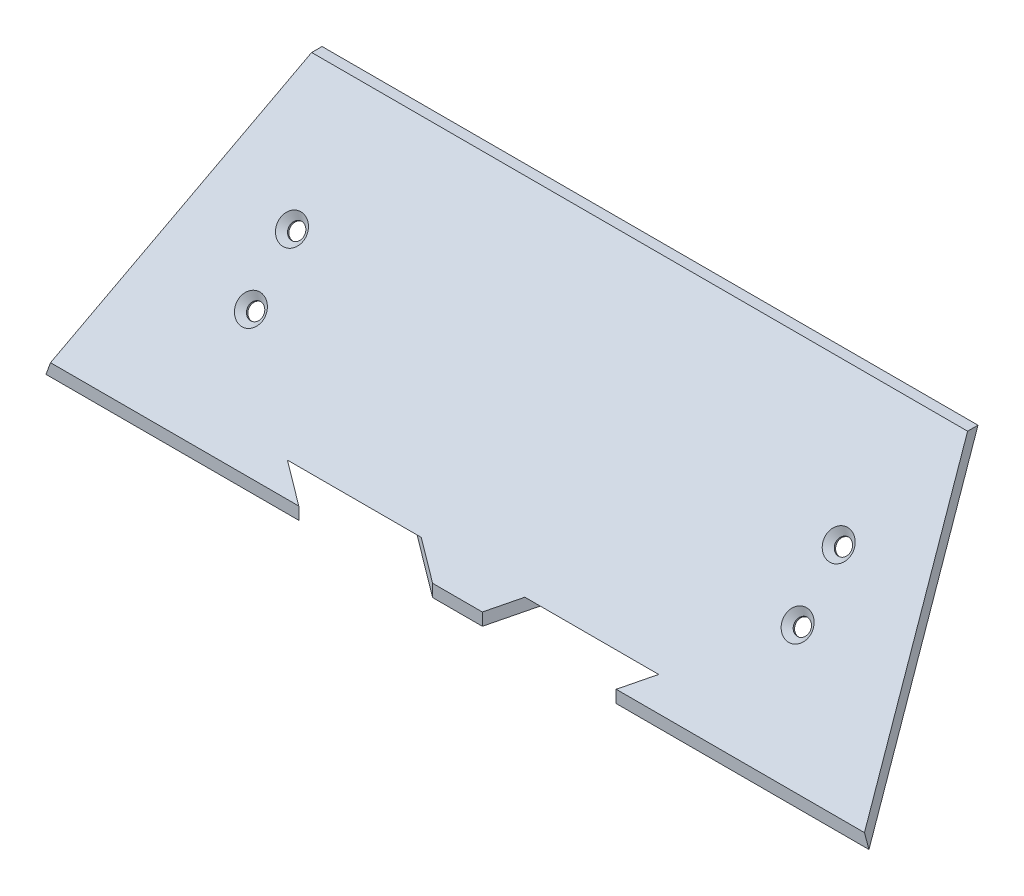
ISO-10303-21;
HEADER;
FILE_DESCRIPTION(('STEP AP214'),'2;1');
FILE_NAME('part.step','',(''),(''),'','','');
FILE_SCHEMA(('AUTOMOTIVE_DESIGN { 1 0 10303 214 1 1 1 1 }'));
ENDSEC;
DATA;
#1=APPLICATION_CONTEXT('core data for automotive mechanical design processes');
#2=APPLICATION_PROTOCOL_DEFINITION('international standard','automotive_design',2000,#1);
#3=PRODUCT_CONTEXT('',#1,'mechanical');
#4=PRODUCT('Part','Part','',(#3));
#5=PRODUCT_RELATED_PRODUCT_CATEGORY('part','',(#4));
#6=PRODUCT_DEFINITION_FORMATION('','',#4);
#7=PRODUCT_DEFINITION_CONTEXT('part definition',#1,'design');
#8=PRODUCT_DEFINITION('design','',#6,#7);
#9=PRODUCT_DEFINITION_SHAPE('','',#8);
#10=(LENGTH_UNIT() NAMED_UNIT(*) SI_UNIT(.MILLI.,.METRE.));
#11=(NAMED_UNIT(*) PLANE_ANGLE_UNIT() SI_UNIT($,.RADIAN.));
#12=(NAMED_UNIT(*) SI_UNIT($,.STERADIAN.) SOLID_ANGLE_UNIT());
#13=UNCERTAINTY_MEASURE_WITH_UNIT(LENGTH_MEASURE(1.E-05),#10,'distance_accuracy_value','');
#14=(GEOMETRIC_REPRESENTATION_CONTEXT(3) GLOBAL_UNCERTAINTY_ASSIGNED_CONTEXT((#13)) GLOBAL_UNIT_ASSIGNED_CONTEXT((#10,
#11,#12)) REPRESENTATION_CONTEXT('',''));
#15=CARTESIAN_POINT('',(0.,0.,0.));
#16=DIRECTION('',(0.,0.,1.));
#17=DIRECTION('',(1.,0.,0.));
#18=AXIS2_PLACEMENT_3D('',#15,#16,#17);
#19=CARTESIAN_POINT('',(186.947944,57.0166879013453,-47.8426817889694));
#20=DIRECTION('',(0.,0.642787609686543,0.766044443118975));
#21=DIRECTION('',(0.,-0.766044443118975,0.642787609686543));
#22=AXIS2_PLACEMENT_3D('',#19,#20,#21);
#23=PLANE('',#22);
#24=CARTESIAN_POINT('',(155.570266506865,35.7397552943462,-29.9892154858524));
#25=DIRECTION('',(0.,0.642787609686543,0.766044443118975));
#26=DIRECTION('',(0.,-0.766044443118975,0.642787609686543));
#27=AXIS2_PLACEMENT_3D('',#24,#25,#26);
#28=CIRCLE('',#27,1.75);
#29=CARTESIAN_POINT('',(155.570266506865,34.399177518888,-28.864337168901));
#30=VERTEX_POINT('',#29);
#31=EDGE_CURVE('E184',#30,#30,#28,.T.);
#32=ORIENTED_EDGE('',*,*,#31,.T.);
#33=EDGE_LOOP('',(#32));
#34=FACE_BOUND('',#33,.T.);
#35=CARTESIAN_POINT('',(155.570266506865,24.6248801619798,-20.6627278617022));
#36=DIRECTION('',(0.,0.642787609686543,0.766044443118975));
#37=DIRECTION('',(0.,-0.766044443118975,0.642787609686543));
#38=AXIS2_PLACEMENT_3D('',#35,#36,#37);
#39=CIRCLE('',#38,1.74999999999999);
#40=CARTESIAN_POINT('',(155.570266506865,23.2843023865216,-19.5378495447508));
#41=VERTEX_POINT('',#40);
#42=EDGE_CURVE('E191',#41,#41,#39,.T.);
#43=ORIENTED_EDGE('',*,*,#42,.T.);
#44=EDGE_LOOP('',(#43));
#45=FACE_BOUND('',#44,.T.);
#46=CARTESIAN_POINT('',(31.3776774931355,35.7397552943464,-29.9892154858526));
#47=DIRECTION('',(0.,0.642787609686543,0.766044443118975));
#48=DIRECTION('',(0.,-0.766044443118975,0.642787609686543));
#49=AXIS2_PLACEMENT_3D('',#46,#47,#48);
#50=CIRCLE('',#49,1.74999999999999);
#51=CARTESIAN_POINT('',(31.3776774931355,34.3991775188882,-28.8643371689012));
#52=VERTEX_POINT('',#51);
#53=EDGE_CURVE('E198',#52,#52,#50,.T.);
#54=ORIENTED_EDGE('',*,*,#53,.T.);
#55=EDGE_LOOP('',(#54));
#56=FACE_BOUND('',#55,.T.);
#57=CARTESIAN_POINT('',(31.3776774931354,24.6248801619801,-20.6627278617024));
#58=DIRECTION('',(0.,0.642787609686543,0.766044443118975));
#59=DIRECTION('',(0.,-0.766044443118975,0.642787609686543));
#60=AXIS2_PLACEMENT_3D('',#57,#58,#59);
#61=CIRCLE('',#60,1.74999999999999);
#62=CARTESIAN_POINT('',(31.3776774931354,23.2843023865219,-19.537849544751));
#63=VERTEX_POINT('',#62);
#64=EDGE_CURVE('E205',#63,#63,#61,.T.);
#65=ORIENTED_EDGE('',*,*,#64,.T.);
#66=EDGE_LOOP('',(#65));
#67=FACE_BOUND('',#66,.T.);
#68=DIRECTION('',(-0.743960541112585,0.511888937521243,-0.429525818677809));
#69=VECTOR('',#68,1.);
#70=CARTESIAN_POINT('',(95.2863367344399,-21.1586125236348,17.7541839648051));
#71=LINE('',#70,#69);
#72=CARTESIAN_POINT('',(57.4238938848892,4.89299179025889,-4.10570760655973));
#73=VERTEX_POINT('',#72);
#74=CARTESIAN_POINT('',(47.2130717621952,11.9186424783822,-10.0009285077445));
#75=VERTEX_POINT('',#74);
#76=EDGE_CURVE('E157',#73,#75,#71,.T.);
#77=ORIENTED_EDGE('',*,*,#76,.F.);
#78=DIRECTION('',(-1.,0.,0.));
#79=VECTOR('',#78,1.);
#80=CARTESIAN_POINT('',(186.947944,4.89299179025889,-4.10570760655973));
#81=LINE('',#80,#79);
#82=CARTESIAN_POINT('',(0.,4.89299179025889,-4.10570760655973));
#83=VERTEX_POINT('',#82);
#84=EDGE_CURVE('E229',#73,#83,#81,.T.);
#85=ORIENTED_EDGE('',*,*,#84,.T.);
#86=DIRECTION('',(-0.268573407547186,-0.737899372701883,0.619171091480102));
#87=VECTOR('',#86,1.);
#88=CARTESIAN_POINT('',(31.0878980749675,90.3062897695394,-75.7759744386099));
#89=LINE('',#88,#87);
#90=CARTESIAN_POINT('',(18.9714738843725,57.0166879013459,-47.8426817889694));
#91=VERTEX_POINT('',#90);
#92=EDGE_CURVE('E220',#91,#83,#89,.T.);
#93=ORIENTED_EDGE('',*,*,#92,.F.);
#94=DIRECTION('',(-1.,0.,0.));
#95=VECTOR('',#94,1.);
#96=CARTESIAN_POINT('',(186.947944,57.0166879013453,-47.8426817889694));
#97=LINE('',#96,#95);
#98=CARTESIAN_POINT('',(167.976470115628,57.0166879013453,-47.8426817889694));
#99=VERTEX_POINT('',#98);
#100=EDGE_CURVE('E236',#99,#91,#97,.T.);
#101=ORIENTED_EDGE('',*,*,#100,.F.);
#102=DIRECTION('',(-0.26857340754718,0.737899372701884,-0.619171091480103));
#103=VECTOR('',#102,1.);
#104=CARTESIAN_POINT('',(169.344914308708,53.2569183810736,-44.6878605711978));
#105=LINE('',#104,#103);
#106=CARTESIAN_POINT('',(186.947944,4.89299179025889,-4.1057076065598));
#107=VERTEX_POINT('',#106);
#108=EDGE_CURVE('E216',#107,#99,#105,.T.);
#109=ORIENTED_EDGE('',*,*,#108,.F.);
#110=CARTESIAN_POINT('',(129.524050115111,4.89299179025889,-4.10570760655973));
#111=VERTEX_POINT('',#110);
#112=EDGE_CURVE('E224',#107,#111,#81,.T.);
#113=ORIENTED_EDGE('',*,*,#112,.T.);
#114=DIRECTION('',(0.743960541112587,0.511888937521242,-0.429525818677808));
#115=VECTOR('',#114,1.);
#116=CARTESIAN_POINT('',(195.133048070905,50.0358702085142,-41.9850802375989));
#117=LINE('',#116,#115);
#118=CARTESIAN_POINT('',(139.734872237805,11.9186424783819,-10.0009285077442));
#119=VERTEX_POINT('',#118);
#120=EDGE_CURVE('E65',#111,#119,#117,.T.);
#121=ORIENTED_EDGE('',*,*,#120,.T.);
#122=DIRECTION('',(1.,0.,0.));
#123=VECTOR('',#122,1.);
#124=CARTESIAN_POINT('',(186.947944,11.9186424783817,-10.0009285077441));
#125=LINE('',#124,#123);
#126=CARTESIAN_POINT('',(109.334872237805,11.918642478382,-10.0009285077443));
#127=VERTEX_POINT('',#126);
#128=EDGE_CURVE('E176',#127,#119,#125,.T.);
#129=ORIENTED_EDGE('',*,*,#128,.F.);
#130=DIRECTION('',(0.743960541112587,0.511888937521242,-0.429525818677808));
#131=VECTOR('',#130,1.);
#132=CARTESIAN_POINT('',(181.558757587574,61.6129554053289,-51.6994081563542));
#133=LINE('',#132,#131);
#134=CARTESIAN_POINT('',(99.1240501151109,4.89299179025889,-4.10570760655973));
#135=VERTEX_POINT('',#134);
#136=EDGE_CURVE('E174',#135,#127,#133,.T.);
#137=ORIENTED_EDGE('',*,*,#136,.F.);
#138=CARTESIAN_POINT('',(87.8238938848893,4.89299179025889,-4.10570760655973));
#139=VERTEX_POINT('',#138);
#140=EDGE_CURVE('E228',#135,#139,#81,.T.);
#141=ORIENTED_EDGE('',*,*,#140,.T.);
#142=DIRECTION('',(-0.743960541112585,0.511888937521243,-0.429525818677809));
#143=VECTOR('',#142,1.);
#144=CARTESIAN_POINT('',(108.860627217771,-9.5815273268201,8.03985604604986));
#145=LINE('',#144,#143);
#146=CARTESIAN_POINT('',(77.6130717621954,11.9186424783821,-10.0009285077444));
#147=VERTEX_POINT('',#146);
#148=EDGE_CURVE('E57',#139,#147,#145,.T.);
#149=ORIENTED_EDGE('',*,*,#148,.T.);
#150=DIRECTION('',(-1.,0.,0.));
#151=VECTOR('',#150,1.);
#152=CARTESIAN_POINT('',(186.947944,11.9186424783817,-10.0009285077441));
#153=LINE('',#152,#151);
#154=EDGE_CURVE('E145',#147,#75,#153,.T.);
#155=ORIENTED_EDGE('',*,*,#154,.T.);
#156=EDGE_LOOP('',(#77,#85,#93,#101,#109,#113,#121,#129,#137,#141,#149,#155));
#157=FACE_BOUND('',#156,.T.);
#158=ADVANCED_FACE('F43',(#34,#45,#56,#67,#157),#23,.F.);
#159=CARTESIAN_POINT('',(186.947944,0.,2.36220000000002));
#160=DIRECTION('',(0.,-0.642787609686543,-0.766044443118975));
#161=DIRECTION('',(0.,0.766044443118975,-0.642787609686543));
#162=AXIS2_PLACEMENT_3D('',#159,#160,#161);
#163=PLANE('',#162);
#164=CARTESIAN_POINT('',(155.570266506865,36.9029117314287,-28.6030196232102));
#165=DIRECTION('',(0.,0.642787609686543,0.766044443118975));
#166=DIRECTION('',(0.,-0.766044443118975,0.642787609686543));
#167=AXIS2_PLACEMENT_3D('',#164,#165,#166);
#168=CIRCLE('',#167,3.15000000000001);
#169=CARTESIAN_POINT('',(155.570266506865,34.4898717356039,-26.5782386526976));
#170=VERTEX_POINT('',#169);
#171=EDGE_CURVE('E178',#170,#170,#168,.T.);
#172=ORIENTED_EDGE('',*,*,#171,.F.);
#173=EDGE_LOOP('',(#172));
#174=FACE_BOUND('',#173,.T.);
#175=CARTESIAN_POINT('',(155.570266506865,25.7880365990624,-19.27653199906));
#176=DIRECTION('',(0.,0.642787609686543,0.766044443118975));
#177=DIRECTION('',(0.,-0.766044443118975,0.642787609686543));
#178=AXIS2_PLACEMENT_3D('',#175,#176,#177);
#179=CIRCLE('',#178,3.14999999999999);
#180=CARTESIAN_POINT('',(155.570266506865,23.3749966032376,-17.2517510285474));
#181=VERTEX_POINT('',#180);
#182=EDGE_CURVE('E185',#181,#181,#179,.T.);
#183=ORIENTED_EDGE('',*,*,#182,.F.);
#184=EDGE_LOOP('',(#183));
#185=FACE_BOUND('',#184,.T.);
#186=CARTESIAN_POINT('',(31.3776774931355,36.9029117314291,-28.6030196232102));
#187=DIRECTION('',(0.,0.642787609686544,0.766044443118975));
#188=DIRECTION('',(0.,-0.766044443118975,0.642787609686544));
#189=AXIS2_PLACEMENT_3D('',#186,#187,#188);
#190=CIRCLE('',#189,3.15);
#191=CARTESIAN_POINT('',(31.3776774931355,34.4898717356044,-26.5782386526976));
#192=VERTEX_POINT('',#191);
#193=EDGE_CURVE('E192',#192,#192,#190,.T.);
#194=ORIENTED_EDGE('',*,*,#193,.F.);
#195=EDGE_LOOP('',(#194));
#196=FACE_BOUND('',#195,.T.);
#197=CARTESIAN_POINT('',(31.3776774931354,25.7880365990628,-19.27653199906));
#198=DIRECTION('',(0.,0.642787609686544,0.766044443118975));
#199=DIRECTION('',(0.,-0.766044443118975,0.642787609686544));
#200=AXIS2_PLACEMENT_3D('',#197,#198,#199);
#201=CIRCLE('',#200,3.15);
#202=CARTESIAN_POINT('',(31.3776774931354,23.374996603238,-17.2517510285474));
#203=VERTEX_POINT('',#202);
#204=EDGE_CURVE('E199',#203,#203,#201,.T.);
#205=ORIENTED_EDGE('',*,*,#204,.F.);
#206=EDGE_LOOP('',(#205));
#207=FACE_BOUND('',#206,.T.);
#208=DIRECTION('',(-0.743960541112585,0.511888937521243,-0.429525818677809));
#209=VECTOR('',#208,1.);
#210=CARTESIAN_POINT('',(88.36558842516,-13.5815672442369,13.7584880654487));
#211=LINE('',#210,#209);
#212=CARTESIAN_POINT('',(57.4238938848892,7.70815212668492,-4.10570760655973));
#213=VERTEX_POINT('',#212);
#214=CARTESIAN_POINT('',(51.3045221798344,11.9186424783822,-7.63872850774447));
#215=VERTEX_POINT('',#214);
#216=EDGE_CURVE('E151',#213,#215,#211,.T.);
#217=ORIENTED_EDGE('',*,*,#216,.T.);
#218=DIRECTION('',(-1.,0.,0.));
#219=VECTOR('',#218,1.);
#220=CARTESIAN_POINT('',(125.977469715276,11.9186424783819,-7.63872850774424));
#221=LINE('',#220,#219);
#222=CARTESIAN_POINT('',(81.7045221798346,11.9186424783822,-7.63872850774445));
#223=VERTEX_POINT('',#222);
#224=EDGE_CURVE('E138',#223,#215,#221,.T.);
#225=ORIENTED_EDGE('',*,*,#224,.F.);
#226=DIRECTION('',(-0.743960541112585,0.511888937521243,-0.429525818677809));
#227=VECTOR('',#226,1.);
#228=CARTESIAN_POINT('',(101.939878908491,-2.0044820474222,4.04416014669348));
#229=LINE('',#228,#227);
#230=CARTESIAN_POINT('',(87.8238938848893,7.70815212668492,-4.10570760655973));
#231=VERTEX_POINT('',#230);
#232=EDGE_CURVE('E130',#231,#223,#229,.T.);
#233=ORIENTED_EDGE('',*,*,#232,.F.);
#234=DIRECTION('',(-1.,0.,0.));
#235=VECTOR('',#234,1.);
#236=CARTESIAN_POINT('',(186.947944,7.70815212668491,-4.10570760655973));
#237=LINE('',#236,#235);
#238=CARTESIAN_POINT('',(99.1240501151109,7.70815212668491,-4.10570760655973));
#239=VERTEX_POINT('',#238);
#240=EDGE_CURVE('E233',#239,#231,#237,.T.);
#241=ORIENTED_EDGE('',*,*,#240,.F.);
#242=DIRECTION('',(0.743960541112587,0.511888937521242,-0.429525818677808));
#243=VECTOR('',#242,1.);
#244=CARTESIAN_POINT('',(85.0080650915091,-2.00448204742218,4.04416014669347));
#245=LINE('',#244,#243);
#246=CARTESIAN_POINT('',(105.243421820166,11.9186424783821,-7.63872850774437));
#247=VERTEX_POINT('',#246);
#248=EDGE_CURVE('E161',#239,#247,#245,.T.);
#249=ORIENTED_EDGE('',*,*,#248,.T.);
#250=DIRECTION('',(1.,0.,0.));
#251=VECTOR('',#250,1.);
#252=CARTESIAN_POINT('',(60.9704742847236,11.9186424783822,-7.63872850774444));
#253=LINE('',#252,#251);
#254=CARTESIAN_POINT('',(135.643421820166,11.9186424783821,-7.63872850774434));
#255=VERTEX_POINT('',#254);
#256=EDGE_CURVE('E164',#247,#255,#253,.T.);
#257=ORIENTED_EDGE('',*,*,#256,.T.);
#258=DIRECTION('',(0.743960541112587,0.511888937521242,-0.429525818677808));
#259=VECTOR('',#258,1.);
#260=CARTESIAN_POINT('',(98.5823555748401,-13.5815672442369,13.7584880654487));
#261=LINE('',#260,#259);
#262=CARTESIAN_POINT('',(129.524050115111,7.70815212668492,-4.10570760655973));
#263=VERTEX_POINT('',#262);
#264=EDGE_CURVE('E168',#263,#255,#261,.T.);
#265=ORIENTED_EDGE('',*,*,#264,.F.);
#266=CARTESIAN_POINT('',(185.923309432854,7.70815212668491,-4.10570760655973));
#267=VERTEX_POINT('',#266);
#268=EDGE_CURVE('E230',#267,#263,#237,.T.);
#269=ORIENTED_EDGE('',*,*,#268,.F.);
#270=DIRECTION('',(0.26857340754718,-0.737899372701884,0.619171091480104));
#271=VECTOR('',#270,1.);
#272=CARTESIAN_POINT('',(188.600387824774,0.352939694774287,2.06604843228709));
#273=LINE('',#272,#271);
#274=CARTESIAN_POINT('',(167.976470115628,57.0166879013453,-45.4804817889699));
#275=VERTEX_POINT('',#274);
#276=EDGE_CURVE('E209',#275,#267,#273,.T.);
#277=ORIENTED_EDGE('',*,*,#276,.F.);
#278=DIRECTION('',(-1.,0.,0.));
#279=VECTOR('',#278,1.);
#280=CARTESIAN_POINT('',(186.947944,57.0166879013453,-45.4804817889694));
#281=LINE('',#280,#279);
#282=CARTESIAN_POINT('',(18.9714738843725,57.0166879013459,-45.4804817889699));
#283=VERTEX_POINT('',#282);
#284=EDGE_CURVE('E227',#275,#283,#281,.T.);
#285=ORIENTED_EDGE('',*,*,#284,.T.);
#286=DIRECTION('',(0.268573407547186,0.737899372701883,-0.619171091480102));
#287=VECTOR('',#286,1.);
#288=CARTESIAN_POINT('',(11.8324245589011,37.4023110832403,-29.0220654351251));
#289=LINE('',#288,#287);
#290=CARTESIAN_POINT('',(1.02463456714589,7.70815212668491,-4.10570760655977));
#291=VERTEX_POINT('',#290);
#292=EDGE_CURVE('E218',#291,#283,#289,.T.);
#293=ORIENTED_EDGE('',*,*,#292,.F.);
#294=EDGE_CURVE('E223',#213,#291,#237,.T.);
#295=ORIENTED_EDGE('',*,*,#294,.F.);
#296=EDGE_LOOP('',(#217,#225,#233,#241,#249,#257,#265,#269,#277,#285,#293,#295));
#297=FACE_BOUND('',#296,.T.);
#298=ADVANCED_FACE('F149',(#174,#185,#196,#207,#297),#163,.F.);
#299=CARTESIAN_POINT('',(186.947944,4.89299179025889,-4.10570760655973));
#300=DIRECTION('',(0.,0.,-1.));
#301=DIRECTION('',(-1.,0.,0.));
#302=AXIS2_PLACEMENT_3D('',#299,#300,#301);
#303=PLANE('',#302);
#304=DIRECTION('',(0.,-1.,0.));
#305=VECTOR('',#304,1.);
#306=CARTESIAN_POINT('',(57.4238938848892,4.8929917902593,-4.10570760655973));
#307=LINE('',#306,#305);
#308=EDGE_CURVE('E11',#213,#73,#307,.T.);
#309=ORIENTED_EDGE('',*,*,#308,.F.);
#310=ORIENTED_EDGE('',*,*,#294,.T.);
#311=DIRECTION('',(0.342020143325667,0.939692620785909,0.));
#312=VECTOR('',#311,1.);
#313=CARTESIAN_POINT('',(21.8687551731408,64.9769028200451,-4.10570760655973));
#314=LINE('',#313,#312);
#315=EDGE_CURVE('E239',#83,#291,#314,.T.);
#316=ORIENTED_EDGE('',*,*,#315,.F.);
#317=ORIENTED_EDGE('',*,*,#84,.F.);
#318=EDGE_LOOP('',(#309,#310,#316,#317));
#319=FACE_BOUND('',#318,.T.);
#320=ADVANCED_FACE('F271',(#319),#303,.F.);
#321=ORIENTED_EDGE('',*,*,#240,.T.);
#322=DIRECTION('',(0.,-1.,0.));
#323=VECTOR('',#322,1.);
#324=CARTESIAN_POINT('',(87.8238938848893,4.8929917902592,-4.10570760655973));
#325=LINE('',#324,#323);
#326=EDGE_CURVE('E50',#231,#139,#325,.T.);
#327=ORIENTED_EDGE('',*,*,#326,.T.);
#328=ORIENTED_EDGE('',*,*,#140,.F.);
#329=DIRECTION('',(0.,-1.,0.));
#330=VECTOR('',#329,1.);
#331=CARTESIAN_POINT('',(99.1240501151109,4.89299179025924,-4.10570760655973));
#332=LINE('',#331,#330);
#333=EDGE_CURVE('E252',#239,#135,#332,.T.);
#334=ORIENTED_EDGE('',*,*,#333,.F.);
#335=EDGE_LOOP('',(#321,#327,#328,#334));
#336=FACE_BOUND('',#335,.T.);
#337=ADVANCED_FACE('F256',(#336),#303,.F.);
#338=CARTESIAN_POINT('',(186.947944,57.0166879013453,-45.4804817889694));
#339=DIRECTION('',(0.,-1.,0.));
#340=DIRECTION('',(0.,0.,-1.));
#341=AXIS2_PLACEMENT_3D('',#338,#339,#340);
#342=PLANE('',#341);
#343=DIRECTION('',(0.,0.,1.));
#344=VECTOR('',#343,1.);
#345=CARTESIAN_POINT('',(18.9714738843725,57.0166879013459,-47.8426817889694));
#346=LINE('',#345,#344);
#347=EDGE_CURVE('E206',#91,#283,#346,.T.);
#348=ORIENTED_EDGE('',*,*,#347,.T.);
#349=ORIENTED_EDGE('',*,*,#284,.F.);
#350=DIRECTION('',(0.,0.,1.));
#351=VECTOR('',#350,1.);
#352=CARTESIAN_POINT('',(167.976470115628,57.0166879013453,-47.8426817889694));
#353=LINE('',#352,#351);
#354=EDGE_CURVE('E211',#99,#275,#353,.T.);
#355=ORIENTED_EDGE('',*,*,#354,.F.);
#356=ORIENTED_EDGE('',*,*,#100,.T.);
#357=EDGE_LOOP('',(#348,#349,#355,#356));
#358=FACE_BOUND('',#357,.T.);
#359=ADVANCED_FACE('F275',(#358),#342,.F.);
#360=ORIENTED_EDGE('',*,*,#268,.T.);
#361=DIRECTION('',(0.,-1.,0.));
#362=VECTOR('',#361,1.);
#363=CARTESIAN_POINT('',(129.524050115111,4.89299179025912,-4.10570760655973));
#364=LINE('',#363,#362);
#365=EDGE_CURVE('E242',#263,#111,#364,.T.);
#366=ORIENTED_EDGE('',*,*,#365,.T.);
#367=ORIENTED_EDGE('',*,*,#112,.F.);
#368=DIRECTION('',(-0.342020143325659,0.939692620785912,0.));
#369=VECTOR('',#368,1.);
#370=CARTESIAN_POINT('',(167.976470115628,57.0166879013453,-4.1057076065598));
#371=LINE('',#370,#369);
#372=EDGE_CURVE('E210',#107,#267,#371,.T.);
#373=ORIENTED_EDGE('',*,*,#372,.T.);
#374=EDGE_LOOP('',(#360,#366,#367,#373));
#375=FACE_BOUND('',#374,.T.);
#376=ADVANCED_FACE('F281',(#375),#303,.F.);
#377=CARTESIAN_POINT('',(167.976470115628,57.0166879013453,-47.8426817889694));
#378=DIRECTION('',(0.939692620785912,0.342020143325659,0.));
#379=DIRECTION('',(-0.342020143325659,0.939692620785912,0.));
#380=AXIS2_PLACEMENT_3D('',#377,#378,#379);
#381=PLANE('',#380);
#382=ORIENTED_EDGE('',*,*,#108,.T.);
#383=ORIENTED_EDGE('',*,*,#354,.T.);
#384=ORIENTED_EDGE('',*,*,#276,.T.);
#385=ORIENTED_EDGE('',*,*,#372,.F.);
#386=EDGE_LOOP('',(#382,#383,#384,#385));
#387=FACE_BOUND('',#386,.T.);
#388=ADVANCED_FACE('F327',(#387),#381,.T.);
#389=CARTESIAN_POINT('',(18.9714738843725,57.0166879013459,-47.8426817889694));
#390=DIRECTION('',(-0.939692620785909,0.342020143325666,0.));
#391=DIRECTION('',(-0.342020143325667,-0.939692620785909,0.));
#392=AXIS2_PLACEMENT_3D('',#389,#390,#391);
#393=PLANE('',#392);
#394=ORIENTED_EDGE('',*,*,#92,.T.);
#395=ORIENTED_EDGE('',*,*,#315,.T.);
#396=ORIENTED_EDGE('',*,*,#292,.T.);
#397=ORIENTED_EDGE('',*,*,#347,.F.);
#398=EDGE_LOOP('',(#394,#395,#396,#397));
#399=FACE_BOUND('',#398,.T.);
#400=ADVANCED_FACE('F269',(#399),#393,.T.);
#401=CARTESIAN_POINT('',(31.3776774931354,25.7880365990628,-19.27653199906));
#402=DIRECTION('',(0.,0.642787609686544,0.766044443118975));
#403=DIRECTION('',(0.,-0.766044443118975,0.642787609686544));
#404=AXIS2_PLACEMENT_3D('',#401,#402,#403);
#405=CYLINDRICAL_SURFACE('',#404,1.74999999999999);
#406=CARTESIAN_POINT('',(31.3776774931354,24.8881339455016,-20.3489942194266));
#407=DIRECTION('',(0.,0.642787609686544,0.766044443118975));
#408=DIRECTION('',(0.,-0.766044443118975,0.642787609686544));
#409=AXIS2_PLACEMENT_3D('',#406,#407,#408);
#410=CIRCLE('',#409,1.74999999999999);
#411=CARTESIAN_POINT('',(31.3776774931354,23.5475561700434,-19.2241159024751));
#412=VERTEX_POINT('',#411);
#413=EDGE_CURVE('E202',#412,#412,#410,.T.);
#414=ORIENTED_EDGE('',*,*,#413,.T.);
#415=EDGE_LOOP('',(#414));
#416=FACE_BOUND('',#415,.T.);
#417=ORIENTED_EDGE('',*,*,#64,.F.);
#418=EDGE_LOOP('',(#417));
#419=FACE_BOUND('',#418,.T.);
#420=ADVANCED_FACE('F315',(#416,#419),#405,.F.);
#421=CARTESIAN_POINT('',(31.3776774931354,25.7880365990628,-19.27653199906));
#422=DIRECTION('',(0.,0.642787609686544,0.766044443118975));
#423=DIRECTION('',(0.,-0.766044443118975,0.642787609686544));
#424=AXIS2_PLACEMENT_3D('',#421,#422,#423);
#425=CONICAL_SURFACE('',#424,3.15,0.785398163397452);
#426=ORIENTED_EDGE('',*,*,#413,.F.);
#427=EDGE_LOOP('',(#426));
#428=FACE_BOUND('',#427,.T.);
#429=ORIENTED_EDGE('',*,*,#204,.T.);
#430=EDGE_LOOP('',(#429));
#431=FACE_BOUND('',#430,.T.);
#432=ADVANCED_FACE('F317',(#428,#431),#425,.F.);
#433=CARTESIAN_POINT('',(31.3776774931355,36.9029117314291,-28.6030196232102));
#434=DIRECTION('',(0.,0.642787609686544,0.766044443118975));
#435=DIRECTION('',(0.,-0.766044443118975,0.642787609686544));
#436=AXIS2_PLACEMENT_3D('',#433,#434,#435);
#437=CYLINDRICAL_SURFACE('',#436,1.74999999999999);
#438=CARTESIAN_POINT('',(31.3776774931355,36.003009077868,-29.6754818435768));
#439=DIRECTION('',(0.,0.642787609686544,0.766044443118975));
#440=DIRECTION('',(0.,-0.766044443118975,0.642787609686544));
#441=AXIS2_PLACEMENT_3D('',#438,#439,#440);
#442=CIRCLE('',#441,1.74999999999999);
#443=CARTESIAN_POINT('',(31.3776774931355,34.6624313024098,-28.5506035266253));
#444=VERTEX_POINT('',#443);
#445=EDGE_CURVE('E195',#444,#444,#442,.T.);
#446=ORIENTED_EDGE('',*,*,#445,.T.);
#447=EDGE_LOOP('',(#446));
#448=FACE_BOUND('',#447,.T.);
#449=ORIENTED_EDGE('',*,*,#53,.F.);
#450=EDGE_LOOP('',(#449));
#451=FACE_BOUND('',#450,.T.);
#452=ADVANCED_FACE('F324',(#448,#451),#437,.F.);
#453=CARTESIAN_POINT('',(31.3776774931355,36.9029117314291,-28.6030196232102));
#454=DIRECTION('',(0.,0.642787609686544,0.766044443118975));
#455=DIRECTION('',(0.,-0.766044443118975,0.642787609686544));
#456=AXIS2_PLACEMENT_3D('',#453,#454,#455);
#457=CONICAL_SURFACE('',#456,3.15,0.785398163397454);
#458=ORIENTED_EDGE('',*,*,#445,.F.);
#459=EDGE_LOOP('',(#458));
#460=FACE_BOUND('',#459,.T.);
#461=ORIENTED_EDGE('',*,*,#193,.T.);
#462=EDGE_LOOP('',(#461));
#463=FACE_BOUND('',#462,.T.);
#464=ADVANCED_FACE('F427',(#460,#463),#457,.F.);
#465=CARTESIAN_POINT('',(155.570266506865,25.7880365990624,-19.27653199906));
#466=DIRECTION('',(0.,0.642787609686543,0.766044443118975));
#467=DIRECTION('',(0.,-0.766044443118975,0.642787609686543));
#468=AXIS2_PLACEMENT_3D('',#465,#466,#467);
#469=CYLINDRICAL_SURFACE('',#468,1.74999999999999);
#470=CARTESIAN_POINT('',(155.570266506865,24.8881339455012,-20.3489942194266));
#471=DIRECTION('',(0.,0.642787609686543,0.766044443118975));
#472=DIRECTION('',(0.,-0.766044443118975,0.642787609686543));
#473=AXIS2_PLACEMENT_3D('',#470,#471,#472);
#474=CIRCLE('',#473,1.75);
#475=CARTESIAN_POINT('',(155.570266506865,23.547556170043,-19.2241159024751));
#476=VERTEX_POINT('',#475);
#477=EDGE_CURVE('E188',#476,#476,#474,.T.);
#478=ORIENTED_EDGE('',*,*,#477,.T.);
#479=EDGE_LOOP('',(#478));
#480=FACE_BOUND('',#479,.T.);
#481=ORIENTED_EDGE('',*,*,#42,.F.);
#482=EDGE_LOOP('',(#481));
#483=FACE_BOUND('',#482,.T.);
#484=ADVANCED_FACE('F416',(#480,#483),#469,.F.);
#485=CARTESIAN_POINT('',(155.570266506865,25.7880365990624,-19.27653199906));
#486=DIRECTION('',(0.,0.642787609686543,0.766044443118975));
#487=DIRECTION('',(0.,-0.766044443118975,0.642787609686543));
#488=AXIS2_PLACEMENT_3D('',#485,#486,#487);
#489=CONICAL_SURFACE('',#488,3.14999999999999,0.785398163397444);
#490=ORIENTED_EDGE('',*,*,#477,.F.);
#491=EDGE_LOOP('',(#490));
#492=FACE_BOUND('',#491,.T.);
#493=ORIENTED_EDGE('',*,*,#182,.T.);
#494=EDGE_LOOP('',(#493));
#495=FACE_BOUND('',#494,.T.);
#496=ADVANCED_FACE('F405',(#492,#495),#489,.F.);
#497=CARTESIAN_POINT('',(155.570266506865,36.9029117314287,-28.6030196232102));
#498=DIRECTION('',(0.,0.642787609686543,0.766044443118975));
#499=DIRECTION('',(0.,-0.766044443118975,0.642787609686543));
#500=AXIS2_PLACEMENT_3D('',#497,#498,#499);
#501=CYLINDRICAL_SURFACE('',#500,1.75);
#502=CARTESIAN_POINT('',(155.570266506865,36.0030090778675,-29.6754818435768));
#503=DIRECTION('',(0.,0.642787609686543,0.766044443118975));
#504=DIRECTION('',(0.,-0.766044443118975,0.642787609686543));
#505=AXIS2_PLACEMENT_3D('',#502,#503,#504);
#506=CIRCLE('',#505,1.75);
#507=CARTESIAN_POINT('',(155.570266506865,34.6624313024093,-28.5506035266254));
#508=VERTEX_POINT('',#507);
#509=EDGE_CURVE('E181',#508,#508,#506,.T.);
#510=ORIENTED_EDGE('',*,*,#509,.T.);
#511=EDGE_LOOP('',(#510));
#512=FACE_BOUND('',#511,.T.);
#513=ORIENTED_EDGE('',*,*,#31,.F.);
#514=EDGE_LOOP('',(#513));
#515=FACE_BOUND('',#514,.T.);
#516=ADVANCED_FACE('F394',(#512,#515),#501,.F.);
#517=CARTESIAN_POINT('',(155.570266506865,36.9029117314287,-28.6030196232102));
#518=DIRECTION('',(0.,0.642787609686543,0.766044443118975));
#519=DIRECTION('',(0.,-0.766044443118975,0.642787609686543));
#520=AXIS2_PLACEMENT_3D('',#517,#518,#519);
#521=CONICAL_SURFACE('',#520,3.15000000000001,0.785398163397454);
#522=ORIENTED_EDGE('',*,*,#509,.F.);
#523=EDGE_LOOP('',(#522));
#524=FACE_BOUND('',#523,.T.);
#525=ORIENTED_EDGE('',*,*,#171,.T.);
#526=EDGE_LOOP('',(#525));
#527=FACE_BOUND('',#526,.T.);
#528=ADVANCED_FACE('F298',(#524,#527),#521,.F.);
#529=CARTESIAN_POINT('',(60.9704742847237,11.9186424783822,-35.2013197409042));
#530=DIRECTION('',(0.,-1.,0.));
#531=DIRECTION('',(1.,0.,0.));
#532=AXIS2_PLACEMENT_3D('',#529,#530,#531);
#533=PLANE('',#532);
#534=ORIENTED_EDGE('',*,*,#128,.T.);
#535=DIRECTION('',(0.86602540378444,0.,-0.499999999999998));
#536=VECTOR('',#535,1.);
#537=CARTESIAN_POINT('',(91.5736632696053,11.9186424783821,17.8049584545433));
#538=LINE('',#537,#536);
#539=EDGE_CURVE('E160',#255,#119,#538,.T.);
#540=ORIENTED_EDGE('',*,*,#539,.F.);
#541=ORIENTED_EDGE('',*,*,#256,.F.);
#542=DIRECTION('',(0.86602540378444,0.,-0.499999999999998));
#543=VECTOR('',#542,1.);
#544=CARTESIAN_POINT('',(83.9736632696054,11.9186424783821,4.64137231701983));
#545=LINE('',#544,#543);
#546=EDGE_CURVE('E165',#247,#127,#545,.T.);
#547=ORIENTED_EDGE('',*,*,#546,.T.);
#548=EDGE_LOOP('',(#534,#540,#541,#547));
#549=FACE_BOUND('',#548,.T.);
#550=ADVANCED_FACE('F288',(#549),#533,.T.);
#551=CARTESIAN_POINT('',(83.9736632696053,-3.88604152327333E-13,4.64137231701984));
#552=DIRECTION('',(0.499999999999998,0.,0.86602540378444));
#553=DIRECTION('',(0.86602540378444,0.,-0.499999999999998));
#554=AXIS2_PLACEMENT_3D('',#551,#552,#553);
#555=PLANE('',#554);
#556=ORIENTED_EDGE('',*,*,#136,.T.);
#557=ORIENTED_EDGE('',*,*,#546,.F.);
#558=ORIENTED_EDGE('',*,*,#248,.F.);
#559=ORIENTED_EDGE('',*,*,#333,.T.);
#560=EDGE_LOOP('',(#556,#557,#558,#559));
#561=FACE_BOUND('',#560,.T.);
#562=ADVANCED_FACE('F290',(#561),#555,.T.);
#563=CARTESIAN_POINT('',(91.5736632696053,-4.18738777281445E-13,17.8049584545433));
#564=DIRECTION('',(0.499999999999998,0.,0.86602540378444));
#565=DIRECTION('',(0.86602540378444,0.,-0.499999999999998));
#566=AXIS2_PLACEMENT_3D('',#563,#564,#565);
#567=PLANE('',#566);
#568=ORIENTED_EDGE('',*,*,#365,.F.);
#569=ORIENTED_EDGE('',*,*,#264,.T.);
#570=ORIENTED_EDGE('',*,*,#539,.T.);
#571=ORIENTED_EDGE('',*,*,#120,.F.);
#572=EDGE_LOOP('',(#568,#569,#570,#571));
#573=FACE_BOUND('',#572,.T.);
#574=ADVANCED_FACE('F284',(#573),#567,.F.);
#575=CARTESIAN_POINT('',(125.977469715277,11.9186424783819,-35.2013197409042));
#576=DIRECTION('',(0.,1.,0.));
#577=DIRECTION('',(-1.,0.,0.));
#578=AXIS2_PLACEMENT_3D('',#575,#576,#577);
#579=PLANE('',#578);
#580=DIRECTION('',(-0.86602540378444,0.,-0.499999999999998));
#581=VECTOR('',#580,1.);
#582=CARTESIAN_POINT('',(102.974280730395,11.918642478382,4.64137231701983));
#583=LINE('',#582,#581);
#584=EDGE_CURVE('E133',#223,#147,#583,.T.);
#585=ORIENTED_EDGE('',*,*,#584,.F.);
#586=ORIENTED_EDGE('',*,*,#224,.T.);
#587=DIRECTION('',(-0.86602540378444,0.,-0.499999999999998));
#588=VECTOR('',#587,1.);
#589=CARTESIAN_POINT('',(95.3742807303949,11.9186424783821,17.8049584545433));
#590=LINE('',#589,#588);
#591=EDGE_CURVE('E146',#215,#75,#590,.T.);
#592=ORIENTED_EDGE('',*,*,#591,.T.);
#593=ORIENTED_EDGE('',*,*,#154,.F.);
#594=EDGE_LOOP('',(#585,#586,#592,#593));
#595=FACE_BOUND('',#594,.T.);
#596=ADVANCED_FACE('F141',(#595),#579,.F.);
#597=CARTESIAN_POINT('',(95.3742807303949,-4.32322035339731E-13,17.8049584545433));
#598=DIRECTION('',(0.499999999999998,0.,-0.86602540378444));
#599=DIRECTION('',(-0.86602540378444,0.,-0.499999999999998));
#600=AXIS2_PLACEMENT_3D('',#597,#598,#599);
#601=PLANE('',#600);
#602=ORIENTED_EDGE('',*,*,#76,.T.);
#603=ORIENTED_EDGE('',*,*,#591,.F.);
#604=ORIENTED_EDGE('',*,*,#216,.F.);
#605=ORIENTED_EDGE('',*,*,#308,.T.);
#606=EDGE_LOOP('',(#602,#603,#604,#605));
#607=FACE_BOUND('',#606,.T.);
#608=ADVANCED_FACE('F516',(#607),#601,.T.);
#609=CARTESIAN_POINT('',(102.974280730395,-4.56511615495978E-13,4.64137231701983));
#610=DIRECTION('',(0.499999999999998,0.,-0.86602540378444));
#611=DIRECTION('',(-0.86602540378444,0.,-0.499999999999998));
#612=AXIS2_PLACEMENT_3D('',#609,#610,#611);
#613=PLANE('',#612);
#614=ORIENTED_EDGE('',*,*,#326,.F.);
#615=ORIENTED_EDGE('',*,*,#232,.T.);
#616=ORIENTED_EDGE('',*,*,#584,.T.);
#617=ORIENTED_EDGE('',*,*,#148,.F.);
#618=EDGE_LOOP('',(#614,#615,#616,#617));
#619=FACE_BOUND('',#618,.T.);
#620=ADVANCED_FACE('F132',(#619),#613,.F.);
#621=CLOSED_SHELL('',(#158,#298,#320,#337,#359,#376,#388,#400,#420,#432,#452,#464,#484,#496,
#516,#528,#550,#562,#574,#596,#608,#620));
#622=MANIFOLD_SOLID_BREP('B2',#621);
#623=ADVANCED_BREP_SHAPE_REPRESENTATION('',(#18,#622),#14);
#624=SHAPE_DEFINITION_REPRESENTATION(#9,#623);
ENDSEC;
END-ISO-10303-21;
